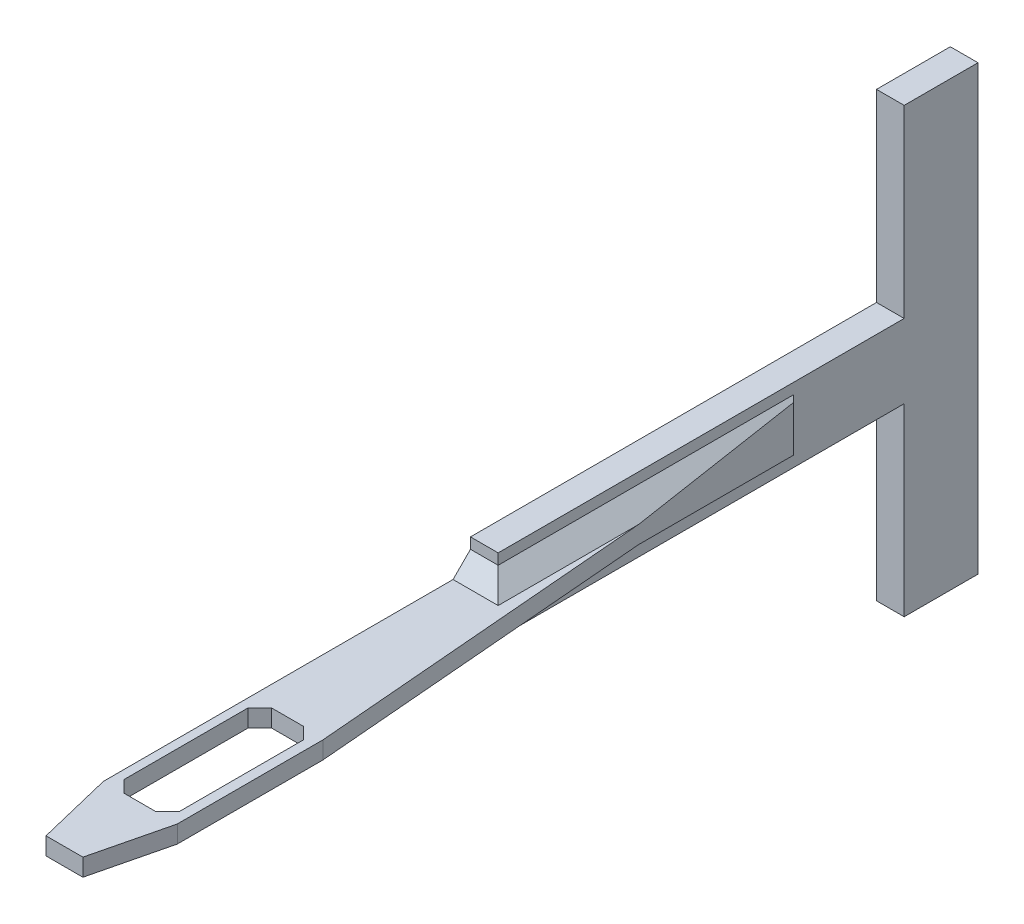
ISO-10303-21;
HEADER;
FILE_DESCRIPTION(('STEP AP214'),'2;1');
FILE_NAME('part.step','',(''),(''),'','','');
FILE_SCHEMA(('AUTOMOTIVE_DESIGN { 1 0 10303 214 1 1 1 1 }'));
ENDSEC;
DATA;
#1=APPLICATION_CONTEXT('core data for automotive mechanical design processes');
#2=APPLICATION_PROTOCOL_DEFINITION('international standard','automotive_design',2000,#1);
#3=PRODUCT_CONTEXT('',#1,'mechanical');
#4=PRODUCT('Part','Part','',(#3));
#5=PRODUCT_RELATED_PRODUCT_CATEGORY('part','',(#4));
#6=PRODUCT_DEFINITION_FORMATION('','',#4);
#7=PRODUCT_DEFINITION_CONTEXT('part definition',#1,'design');
#8=PRODUCT_DEFINITION('design','',#6,#7);
#9=PRODUCT_DEFINITION_SHAPE('','',#8);
#10=(LENGTH_UNIT() NAMED_UNIT(*) SI_UNIT(.MILLI.,.METRE.));
#11=(NAMED_UNIT(*) PLANE_ANGLE_UNIT() SI_UNIT($,.RADIAN.));
#12=(NAMED_UNIT(*) SI_UNIT($,.STERADIAN.) SOLID_ANGLE_UNIT());
#13=UNCERTAINTY_MEASURE_WITH_UNIT(LENGTH_MEASURE(1.E-05),#10,'distance_accuracy_value','');
#14=(GEOMETRIC_REPRESENTATION_CONTEXT(3) GLOBAL_UNCERTAINTY_ASSIGNED_CONTEXT((#13)) GLOBAL_UNIT_ASSIGNED_CONTEXT((#10,
#11,#12)) REPRESENTATION_CONTEXT('',''));
#15=CARTESIAN_POINT('',(0.,0.,0.));
#16=DIRECTION('',(0.,0.,1.));
#17=DIRECTION('',(1.,0.,0.));
#18=AXIS2_PLACEMENT_3D('',#15,#16,#17);
#19=CARTESIAN_POINT('',(0.,3.,0.));
#20=DIRECTION('',(0.,1.,0.));
#21=DIRECTION('',(0.,0.,1.));
#22=AXIS2_PLACEMENT_3D('',#19,#20,#21);
#23=PLANE('',#22);
#24=DIRECTION('',(0.0830454798537444,0.,0.996545758244879));
#25=VECTOR('',#24,1.);
#26=CARTESIAN_POINT('',(3.17499999999983,3.,-50.7999999999999));
#27=LINE('',#26,#25);
#28=CARTESIAN_POINT('',(1.41250000000058,3.,-71.9499999999898));
#29=VERTEX_POINT('',#28);
#30=CARTESIAN_POINT('',(6.35,3.,-12.6999999999999));
#31=VERTEX_POINT('',#30);
#32=EDGE_CURVE('E277',#29,#31,#27,.T.);
#33=ORIENTED_EDGE('',*,*,#32,.F.);
#34=DIRECTION('',(0.,0.,1.));
#35=VECTOR('',#34,1.);
#36=CARTESIAN_POINT('',(1.41250000000042,3.,-50.7999999999999));
#37=LINE('',#36,#35);
#38=CARTESIAN_POINT('',(1.4125000000004,3.,-47.7999999999999));
#39=VERTEX_POINT('',#38);
#40=EDGE_CURVE('E396',#29,#39,#37,.T.);
#41=ORIENTED_EDGE('',*,*,#40,.T.);
#42=DIRECTION('',(-1.,0.,0.));
#43=VECTOR('',#42,1.);
#44=CARTESIAN_POINT('',(-6.34999999999954,3.,-47.8));
#45=LINE('',#44,#43);
#46=CARTESIAN_POINT('',(-6.35000000000017,3.,-47.8));
#47=VERTEX_POINT('',#46);
#48=EDGE_CURVE('E394',#39,#47,#45,.T.);
#49=ORIENTED_EDGE('',*,*,#48,.T.);
#50=DIRECTION('',(0.,0.,1.));
#51=VECTOR('',#50,1.);
#52=CARTESIAN_POINT('',(-6.35000000000017,3.,-25.3999999999999));
#53=LINE('',#52,#51);
#54=CARTESIAN_POINT('',(-6.35,3.,12.3426855325893));
#55=VERTEX_POINT('',#54);
#56=EDGE_CURVE('E313',#47,#55,#53,.T.);
#57=ORIENTED_EDGE('',*,*,#56,.T.);
#58=DIRECTION('',(0.236274045216728,0.,0.971686459490367));
#59=VECTOR('',#58,1.);
#60=CARTESIAN_POINT('',(-6.35,3.,12.3426855325893));
#61=LINE('',#60,#59);
#62=CARTESIAN_POINT('',(-3.17499999999986,3.,25.4000000000001));
#63=VERTEX_POINT('',#62);
#64=EDGE_CURVE('E310',#55,#63,#61,.T.);
#65=ORIENTED_EDGE('',*,*,#64,.T.);
#66=DIRECTION('',(1.,0.,0.));
#67=VECTOR('',#66,1.);
#68=CARTESIAN_POINT('',(3.175,3.,25.4));
#69=LINE('',#68,#67);
#70=CARTESIAN_POINT('',(3.175,3.,25.4));
#71=VERTEX_POINT('',#70);
#72=EDGE_CURVE('E312',#63,#71,#69,.T.);
#73=ORIENTED_EDGE('',*,*,#72,.T.);
#74=DIRECTION('',(0.236274045216719,0.,-0.971686459490369));
#75=VECTOR('',#74,1.);
#76=CARTESIAN_POINT('',(6.35,3.,12.3426855325893));
#77=LINE('',#76,#75);
#78=CARTESIAN_POINT('',(6.35,3.,12.3426855325893));
#79=VERTEX_POINT('',#78);
#80=EDGE_CURVE('E315',#71,#79,#77,.T.);
#81=ORIENTED_EDGE('',*,*,#80,.T.);
#82=DIRECTION('',(0.,0.,-1.));
#83=VECTOR('',#82,1.);
#84=CARTESIAN_POINT('',(6.35,3.,12.3426855325893));
#85=LINE('',#84,#83);
#86=EDGE_CURVE('E317',#79,#31,#85,.T.);
#87=ORIENTED_EDGE('',*,*,#86,.T.);
#88=EDGE_LOOP('',(#33,#41,#49,#57,#65,#73,#81,#87));
#89=FACE_BOUND('',#88,.T.);
#90=DIRECTION('',(1.,0.,0.));
#91=VECTOR('',#90,1.);
#92=CARTESIAN_POINT('',(4.67317138314732,3.,12.3426855325893));
#93=LINE('',#92,#91);
#94=CARTESIAN_POINT('',(-2.85182861685268,3.,12.3426855325893));
#95=VERTEX_POINT('',#94);
#96=CARTESIAN_POINT('',(2.67317138314731,3.,12.3426855325893));
#97=VERTEX_POINT('',#96);
#98=EDGE_CURVE('E289',#95,#97,#93,.T.);
#99=ORIENTED_EDGE('',*,*,#98,.F.);
#100=DIRECTION('',(0.707106781186544,0.,0.707106781186551));
#101=VECTOR('',#100,1.);
#102=CARTESIAN_POINT('',(-4.85182861685268,3.,10.3426855325893));
#103=LINE('',#102,#101);
#104=CARTESIAN_POINT('',(-4.85182861685268,3.,10.3426855325893));
#105=VERTEX_POINT('',#104);
#106=EDGE_CURVE('E364',#95,#105,#103,.F.);
#107=ORIENTED_EDGE('',*,*,#106,.T.);
#108=DIRECTION('',(0.,0.,1.));
#109=VECTOR('',#108,1.);
#110=CARTESIAN_POINT('',(-4.85182861685268,3.,12.3426855325893));
#111=LINE('',#110,#109);
#112=CARTESIAN_POINT('',(-4.85182861685268,3.,-11.0573144674107));
#113=VERTEX_POINT('',#112);
#114=EDGE_CURVE('E286',#113,#105,#111,.T.);
#115=ORIENTED_EDGE('',*,*,#114,.F.);
#116=DIRECTION('',(-0.707106781186549,0.,0.707106781186546));
#117=VECTOR('',#116,1.);
#118=CARTESIAN_POINT('',(-2.85182861685267,3.,-13.0573144674107));
#119=LINE('',#118,#117);
#120=CARTESIAN_POINT('',(-2.85182861685267,3.,-13.0573144674107));
#121=VERTEX_POINT('',#120);
#122=EDGE_CURVE('E376',#113,#121,#119,.F.);
#123=ORIENTED_EDGE('',*,*,#122,.T.);
#124=DIRECTION('',(-1.,0.,0.));
#125=VECTOR('',#124,1.);
#126=CARTESIAN_POINT('',(4.67317138314732,3.,-13.0573144674107));
#127=LINE('',#126,#125);
#128=CARTESIAN_POINT('',(2.67317138314732,3.,-13.0573144674107));
#129=VERTEX_POINT('',#128);
#130=EDGE_CURVE('E296',#129,#121,#127,.T.);
#131=ORIENTED_EDGE('',*,*,#130,.F.);
#132=DIRECTION('',(-0.707106781186544,0.,-0.707106781186552));
#133=VECTOR('',#132,1.);
#134=CARTESIAN_POINT('',(4.67317138314732,3.,-11.0573144674107));
#135=LINE('',#134,#133);
#136=CARTESIAN_POINT('',(4.67317138314732,3.,-11.0573144674107));
#137=VERTEX_POINT('',#136);
#138=EDGE_CURVE('E372',#129,#137,#135,.F.);
#139=ORIENTED_EDGE('',*,*,#138,.T.);
#140=DIRECTION('',(0.,0.,-1.));
#141=VECTOR('',#140,1.);
#142=CARTESIAN_POINT('',(4.67317138314732,3.,12.3426855325893));
#143=LINE('',#142,#141);
#144=CARTESIAN_POINT('',(4.67317138314732,3.,10.3426855325893));
#145=VERTEX_POINT('',#144);
#146=EDGE_CURVE('E293',#145,#137,#143,.T.);
#147=ORIENTED_EDGE('',*,*,#146,.F.);
#148=DIRECTION('',(0.70710678118655,0.,-0.707106781186545));
#149=VECTOR('',#148,1.);
#150=CARTESIAN_POINT('',(2.67317138314731,3.,12.3426855325893));
#151=LINE('',#150,#149);
#152=EDGE_CURVE('E368',#145,#97,#151,.F.);
#153=ORIENTED_EDGE('',*,*,#152,.T.);
#154=EDGE_LOOP('',(#99,#107,#115,#123,#131,#139,#147,#153));
#155=FACE_BOUND('',#154,.T.);
#156=ADVANCED_FACE('F33',(#89,#155),#23,.T.);
#157=CARTESIAN_POINT('',(0.,0.,0.));
#158=DIRECTION('',(0.,1.,0.));
#159=DIRECTION('',(0.,0.,1.));
#160=AXIS2_PLACEMENT_3D('',#157,#158,#159);
#161=PLANE('',#160);
#162=DIRECTION('',(1.,0.,0.));
#163=VECTOR('',#162,1.);
#164=CARTESIAN_POINT('',(3.67817689336587E-13,0.,-47.7999999999999));
#165=LINE('',#164,#163);
#166=CARTESIAN_POINT('',(-6.34999999999954,0.,-47.8));
#167=VERTEX_POINT('',#166);
#168=CARTESIAN_POINT('',(1.4125000000004,0.,-47.7999999999999));
#169=VERTEX_POINT('',#168);
#170=EDGE_CURVE('E388',#167,#169,#165,.T.);
#171=ORIENTED_EDGE('',*,*,#170,.T.);
#172=DIRECTION('',(0.,0.,-1.));
#173=VECTOR('',#172,1.);
#174=CARTESIAN_POINT('',(1.41250000000003,0.,0.));
#175=LINE('',#174,#173);
#176=CARTESIAN_POINT('',(1.41250000000058,0.,-71.9499999999898));
#177=VERTEX_POINT('',#176);
#178=EDGE_CURVE('E390',#169,#177,#175,.T.);
#179=ORIENTED_EDGE('',*,*,#178,.T.);
#180=DIRECTION('',(0.0830454798537444,0.,0.996545758244879));
#181=VECTOR('',#180,1.);
#182=CARTESIAN_POINT('',(7.35724137931039,0.,-0.613103448275899));
#183=LINE('',#182,#181);
#184=CARTESIAN_POINT('',(6.35,0.,-12.6999999999999));
#185=VERTEX_POINT('',#184);
#186=EDGE_CURVE('E283',#177,#185,#183,.T.);
#187=ORIENTED_EDGE('',*,*,#186,.T.);
#188=DIRECTION('',(0.,0.,-1.));
#189=VECTOR('',#188,1.);
#190=CARTESIAN_POINT('',(6.34999999999983,0.,-25.4000000000001));
#191=LINE('',#190,#189);
#192=CARTESIAN_POINT('',(6.35,0.,12.3426855325893));
#193=VERTEX_POINT('',#192);
#194=EDGE_CURVE('E328',#193,#185,#191,.T.);
#195=ORIENTED_EDGE('',*,*,#194,.F.);
#196=DIRECTION('',(0.236274045216719,0.,-0.971686459490369));
#197=VECTOR('',#196,1.);
#198=CARTESIAN_POINT('',(6.35,0.,12.3426855325893));
#199=LINE('',#198,#197);
#200=CARTESIAN_POINT('',(3.175,0.,25.4));
#201=VERTEX_POINT('',#200);
#202=EDGE_CURVE('E325',#201,#193,#199,.T.);
#203=ORIENTED_EDGE('',*,*,#202,.F.);
#204=DIRECTION('',(1.,0.,0.));
#205=VECTOR('',#204,1.);
#206=CARTESIAN_POINT('',(3.175,0.,25.4));
#207=LINE('',#206,#205);
#208=CARTESIAN_POINT('',(-3.17499999999986,0.,25.4000000000001));
#209=VERTEX_POINT('',#208);
#210=EDGE_CURVE('E323',#209,#201,#207,.T.);
#211=ORIENTED_EDGE('',*,*,#210,.F.);
#212=DIRECTION('',(0.236274045216728,0.,0.971686459490367));
#213=VECTOR('',#212,1.);
#214=CARTESIAN_POINT('',(-6.35,0.,12.3426855325893));
#215=LINE('',#214,#213);
#216=CARTESIAN_POINT('',(-6.35,0.,12.3426855325893));
#217=VERTEX_POINT('',#216);
#218=EDGE_CURVE('E321',#217,#209,#215,.T.);
#219=ORIENTED_EDGE('',*,*,#218,.F.);
#220=DIRECTION('',(0.,0.,1.));
#221=VECTOR('',#220,1.);
#222=CARTESIAN_POINT('',(-6.35,0.,12.3426855325893));
#223=LINE('',#222,#221);
#224=EDGE_CURVE('E299',#167,#217,#223,.T.);
#225=ORIENTED_EDGE('',*,*,#224,.F.);
#226=EDGE_LOOP('',(#171,#179,#187,#195,#203,#211,#219,#225));
#227=FACE_BOUND('',#226,.T.);
#228=DIRECTION('',(-1.,0.,0.));
#229=VECTOR('',#228,1.);
#230=CARTESIAN_POINT('',(4.67317138314732,0.,-13.0573144674107));
#231=LINE('',#230,#229);
#232=CARTESIAN_POINT('',(2.67317138314732,0.,-13.0573144674107));
#233=VERTEX_POINT('',#232);
#234=CARTESIAN_POINT('',(-2.85182861685267,0.,-13.0573144674107));
#235=VERTEX_POINT('',#234);
#236=EDGE_CURVE('E290',#233,#235,#231,.T.);
#237=ORIENTED_EDGE('',*,*,#236,.T.);
#238=DIRECTION('',(0.707106781186549,0.,-0.707106781186546));
#239=VECTOR('',#238,1.);
#240=CARTESIAN_POINT('',(-7.95457154213169,0.,-7.95457154213173));
#241=LINE('',#240,#239);
#242=CARTESIAN_POINT('',(-4.85182861685268,0.,-11.0573144674107));
#243=VERTEX_POINT('',#242);
#244=EDGE_CURVE('E374',#235,#243,#241,.F.);
#245=ORIENTED_EDGE('',*,*,#244,.T.);
#246=DIRECTION('',(0.,0.,1.));
#247=VECTOR('',#246,1.);
#248=CARTESIAN_POINT('',(-4.85182861685268,0.,12.3426855325893));
#249=LINE('',#248,#247);
#250=CARTESIAN_POINT('',(-4.85182861685268,0.,10.3426855325893));
#251=VERTEX_POINT('',#250);
#252=EDGE_CURVE('E285',#243,#251,#249,.T.);
#253=ORIENTED_EDGE('',*,*,#252,.T.);
#254=DIRECTION('',(-0.707106781186544,0.,-0.707106781186551));
#255=VECTOR('',#254,1.);
#256=CARTESIAN_POINT('',(-7.597257074721,0.,7.59725707472092));
#257=LINE('',#256,#255);
#258=CARTESIAN_POINT('',(-2.85182861685268,0.,12.3426855325893));
#259=VERTEX_POINT('',#258);
#260=EDGE_CURVE('E362',#251,#259,#257,.F.);
#261=ORIENTED_EDGE('',*,*,#260,.T.);
#262=DIRECTION('',(1.,0.,0.));
#263=VECTOR('',#262,1.);
#264=CARTESIAN_POINT('',(4.67317138314732,0.,12.3426855325893));
#265=LINE('',#264,#263);
#266=CARTESIAN_POINT('',(2.67317138314731,0.,12.3426855325893));
#267=VERTEX_POINT('',#266);
#268=EDGE_CURVE('E302',#259,#267,#265,.T.);
#269=ORIENTED_EDGE('',*,*,#268,.T.);
#270=DIRECTION('',(-0.70710678118655,0.,0.707106781186545));
#271=VECTOR('',#270,1.);
#272=CARTESIAN_POINT('',(7.50792845786829,0.,7.50792845786834));
#273=LINE('',#272,#271);
#274=CARTESIAN_POINT('',(4.67317138314732,0.,10.3426855325893));
#275=VERTEX_POINT('',#274);
#276=EDGE_CURVE('E366',#267,#275,#273,.F.);
#277=ORIENTED_EDGE('',*,*,#276,.T.);
#278=DIRECTION('',(0.,0.,-1.));
#279=VECTOR('',#278,1.);
#280=CARTESIAN_POINT('',(4.67317138314732,0.,12.3426855325893));
#281=LINE('',#280,#279);
#282=CARTESIAN_POINT('',(4.67317138314732,0.,-11.0573144674107));
#283=VERTEX_POINT('',#282);
#284=EDGE_CURVE('E305',#275,#283,#281,.T.);
#285=ORIENTED_EDGE('',*,*,#284,.T.);
#286=DIRECTION('',(0.707106781186544,0.,0.707106781186552));
#287=VECTOR('',#286,1.);
#288=CARTESIAN_POINT('',(7.86524292527903,0.,-7.86524292527894));
#289=LINE('',#288,#287);
#290=EDGE_CURVE('E370',#283,#233,#289,.F.);
#291=ORIENTED_EDGE('',*,*,#290,.T.);
#292=EDGE_LOOP('',(#237,#245,#253,#261,#269,#277,#285,#291));
#293=FACE_BOUND('',#292,.T.);
#294=ADVANCED_FACE('F518',(#227,#293),#161,.F.);
#295=CARTESIAN_POINT('',(-6.35,3.,12.3426855325893));
#296=DIRECTION('',(1.,0.,0.));
#297=DIRECTION('',(0.,0.,-1.));
#298=AXIS2_PLACEMENT_3D('',#295,#296,#297);
#299=PLANE('',#298);
#300=DIRECTION('',(0.,1.,0.));
#301=VECTOR('',#300,1.);
#302=CARTESIAN_POINT('',(-6.34999999999951,-4.85000000000001,-50.7999999999999));
#303=LINE('',#302,#301);
#304=CARTESIAN_POINT('',(-6.34999999999951,-4.85000000000001,-50.7999999999999));
#305=VERTEX_POINT('',#304);
#306=CARTESIAN_POINT('',(-6.34999999999951,-2.99999999999997,-50.7999999999999));
#307=VERTEX_POINT('',#306);
#308=EDGE_CURVE('E273',#305,#307,#303,.T.);
#309=ORIENTED_EDGE('',*,*,#308,.T.);
#310=DIRECTION('',(0.,0.707106781186552,0.707106781186543));
#311=VECTOR('',#310,1.);
#312=CARTESIAN_POINT('',(-6.34999999999978,31.5713427662947,-16.2286572337057));
#313=LINE('',#312,#311);
#314=EDGE_CURVE('E406',#307,#167,#313,.T.);
#315=ORIENTED_EDGE('',*,*,#314,.T.);
#316=ORIENTED_EDGE('',*,*,#224,.T.);
#317=DIRECTION('',(0.,-1.,0.));
#318=VECTOR('',#317,1.);
#319=CARTESIAN_POINT('',(-6.35,3.,12.3426855325893));
#320=LINE('',#319,#318);
#321=EDGE_CURVE('E339',#55,#217,#320,.T.);
#322=ORIENTED_EDGE('',*,*,#321,.F.);
#323=ORIENTED_EDGE('',*,*,#56,.F.);
#324=DIRECTION('',(0.,-0.707106781186548,0.707106781186547));
#325=VECTOR('',#324,1.);
#326=CARTESIAN_POINT('',(-6.34999999999977,-27.0713427662946,-17.7286572337054));
#327=LINE('',#326,#325);
#328=CARTESIAN_POINT('',(-6.34999999999951,5.99999999999994,-50.7999999999999));
#329=VERTEX_POINT('',#328);
#330=EDGE_CURVE('E11',#47,#329,#327,.F.);
#331=ORIENTED_EDGE('',*,*,#330,.T.);
#332=CARTESIAN_POINT('',(-6.34999999999951,7.84999999999999,-50.7999999999999));
#333=VERTEX_POINT('',#332);
#334=EDGE_CURVE('E269',#329,#333,#303,.T.);
#335=ORIENTED_EDGE('',*,*,#334,.T.);
#336=DIRECTION('',(0.,0.,-1.));
#337=VECTOR('',#336,1.);
#338=CARTESIAN_POINT('',(-6.34999999999898,7.84999999999999,-120.65));
#339=LINE('',#338,#337);
#340=CARTESIAN_POINT('',(-6.34999999999898,7.84999999999999,-120.65));
#341=VERTEX_POINT('',#340);
#342=EDGE_CURVE('E237',#333,#341,#339,.T.);
#343=ORIENTED_EDGE('',*,*,#342,.T.);
#344=DIRECTION('',(0.,1.,0.));
#345=VECTOR('',#344,1.);
#346=CARTESIAN_POINT('',(-6.34999999999898,7.84999999999999,-120.65));
#347=LINE('',#346,#345);
#348=CARTESIAN_POINT('',(-6.34999999999898,39.6,-120.65));
#349=VERTEX_POINT('',#348);
#350=EDGE_CURVE('E479',#341,#349,#347,.T.);
#351=ORIENTED_EDGE('',*,*,#350,.T.);
#352=DIRECTION('',(0.,0.,-1.));
#353=VECTOR('',#352,1.);
#354=CARTESIAN_POINT('',(-6.34999999999898,39.6,-120.65));
#355=LINE('',#354,#353);
#356=CARTESIAN_POINT('',(-6.34999999999888,39.6,-133.35));
#357=VERTEX_POINT('',#356);
#358=EDGE_CURVE('E483',#349,#357,#355,.T.);
#359=ORIENTED_EDGE('',*,*,#358,.T.);
#360=DIRECTION('',(0.,-1.,0.));
#361=VECTOR('',#360,1.);
#362=CARTESIAN_POINT('',(-6.34999999999888,-36.6,-133.35));
#363=LINE('',#362,#361);
#364=CARTESIAN_POINT('',(-6.34999999999888,-36.6,-133.35));
#365=VERTEX_POINT('',#364);
#366=EDGE_CURVE('E484',#357,#365,#363,.T.);
#367=ORIENTED_EDGE('',*,*,#366,.T.);
#368=DIRECTION('',(0.,0.,1.));
#369=VECTOR('',#368,1.);
#370=CARTESIAN_POINT('',(-6.34999999999898,-36.6,-120.65));
#371=LINE('',#370,#369);
#372=CARTESIAN_POINT('',(-6.34999999999898,-36.6,-120.65));
#373=VERTEX_POINT('',#372);
#374=EDGE_CURVE('E489',#365,#373,#371,.T.);
#375=ORIENTED_EDGE('',*,*,#374,.T.);
#376=DIRECTION('',(0.,1.,0.));
#377=VECTOR('',#376,1.);
#378=CARTESIAN_POINT('',(-6.34999999999898,-36.6,-120.65));
#379=LINE('',#378,#377);
#380=CARTESIAN_POINT('',(-6.34999999999898,-4.85000000000001,-120.65));
#381=VERTEX_POINT('',#380);
#382=EDGE_CURVE('E491',#373,#381,#379,.T.);
#383=ORIENTED_EDGE('',*,*,#382,.T.);
#384=DIRECTION('',(0.,0.,1.));
#385=VECTOR('',#384,1.);
#386=CARTESIAN_POINT('',(-6.34999999999898,-4.85000000000001,-120.65));
#387=LINE('',#386,#385);
#388=EDGE_CURVE('E230',#381,#305,#387,.T.);
#389=ORIENTED_EDGE('',*,*,#388,.T.);
#390=EDGE_LOOP('',(#309,#315,#316,#322,#323,#331,#335,#343,#351,#359,#367,#375,#383,#389));
#391=FACE_BOUND('',#390,.T.);
#392=ADVANCED_FACE('F429',(#391),#299,.F.);
#393=CARTESIAN_POINT('',(-6.35,3.,12.3426855325893));
#394=DIRECTION('',(0.971686459490366,0.,-0.236274045216728));
#395=DIRECTION('',(-0.236274045216728,0.,-0.971686459490366));
#396=AXIS2_PLACEMENT_3D('',#393,#394,#395);
#397=PLANE('',#396);
#398=ORIENTED_EDGE('',*,*,#218,.T.);
#399=DIRECTION('',(0.,-1.,0.));
#400=VECTOR('',#399,1.);
#401=CARTESIAN_POINT('',(-3.17499999999986,3.,25.4000000000001));
#402=LINE('',#401,#400);
#403=EDGE_CURVE('E336',#63,#209,#402,.T.);
#404=ORIENTED_EDGE('',*,*,#403,.F.);
#405=ORIENTED_EDGE('',*,*,#64,.F.);
#406=ORIENTED_EDGE('',*,*,#321,.T.);
#407=EDGE_LOOP('',(#398,#404,#405,#406));
#408=FACE_BOUND('',#407,.T.);
#409=ADVANCED_FACE('F435',(#408),#397,.F.);
#410=CARTESIAN_POINT('',(3.175,3.,25.4));
#411=DIRECTION('',(0.,0.,-1.));
#412=DIRECTION('',(-1.,0.,0.));
#413=AXIS2_PLACEMENT_3D('',#410,#411,#412);
#414=PLANE('',#413);
#415=ORIENTED_EDGE('',*,*,#210,.T.);
#416=DIRECTION('',(0.,-1.,0.));
#417=VECTOR('',#416,1.);
#418=CARTESIAN_POINT('',(3.175,3.,25.4));
#419=LINE('',#418,#417);
#420=EDGE_CURVE('E333',#71,#201,#419,.T.);
#421=ORIENTED_EDGE('',*,*,#420,.F.);
#422=ORIENTED_EDGE('',*,*,#72,.F.);
#423=ORIENTED_EDGE('',*,*,#403,.T.);
#424=EDGE_LOOP('',(#415,#421,#422,#423));
#425=FACE_BOUND('',#424,.T.);
#426=ADVANCED_FACE('F441',(#425),#414,.F.);
#427=CARTESIAN_POINT('',(6.35,3.,12.3426855325893));
#428=DIRECTION('',(-0.971686459490369,0.,-0.236274045216719));
#429=DIRECTION('',(-0.236274045216719,0.,0.971686459490369));
#430=AXIS2_PLACEMENT_3D('',#427,#428,#429);
#431=PLANE('',#430);
#432=ORIENTED_EDGE('',*,*,#202,.T.);
#433=DIRECTION('',(0.,-1.,0.));
#434=VECTOR('',#433,1.);
#435=CARTESIAN_POINT('',(6.35,3.,12.3426855325893));
#436=LINE('',#435,#434);
#437=EDGE_CURVE('E320',#79,#193,#436,.T.);
#438=ORIENTED_EDGE('',*,*,#437,.F.);
#439=ORIENTED_EDGE('',*,*,#80,.F.);
#440=ORIENTED_EDGE('',*,*,#420,.T.);
#441=EDGE_LOOP('',(#432,#438,#439,#440));
#442=FACE_BOUND('',#441,.T.);
#443=ADVANCED_FACE('F445',(#442),#431,.F.);
#444=CARTESIAN_POINT('',(6.34999999999983,3.,-25.4000000000001));
#445=DIRECTION('',(-1.,0.,0.));
#446=DIRECTION('',(0.,0.,1.));
#447=AXIS2_PLACEMENT_3D('',#444,#445,#446);
#448=PLANE('',#447);
#449=ORIENTED_EDGE('',*,*,#194,.T.);
#450=DIRECTION('',(0.,1.,0.));
#451=VECTOR('',#450,1.);
#452=CARTESIAN_POINT('',(6.35,-22.4,-12.6999999999999));
#453=LINE('',#452,#451);
#454=EDGE_CURVE('E279',#185,#31,#453,.T.);
#455=ORIENTED_EDGE('',*,*,#454,.T.);
#456=ORIENTED_EDGE('',*,*,#86,.F.);
#457=ORIENTED_EDGE('',*,*,#437,.T.);
#458=EDGE_LOOP('',(#449,#455,#456,#457));
#459=FACE_BOUND('',#458,.T.);
#460=ADVANCED_FACE('F448',(#459),#448,.F.);
#461=CARTESIAN_POINT('',(-4.85182861685268,3.,12.3426855325893));
#462=DIRECTION('',(1.,0.,0.));
#463=DIRECTION('',(0.,0.,-1.));
#464=AXIS2_PLACEMENT_3D('',#461,#462,#463);
#465=PLANE('',#464);
#466=ORIENTED_EDGE('',*,*,#114,.T.);
#467=DIRECTION('',(0.,-1.,0.));
#468=VECTOR('',#467,1.);
#469=CARTESIAN_POINT('',(-4.85182861685268,0.,10.3426855325893));
#470=LINE('',#469,#468);
#471=EDGE_CURVE('E344',#105,#251,#470,.T.);
#472=ORIENTED_EDGE('',*,*,#471,.T.);
#473=ORIENTED_EDGE('',*,*,#252,.F.);
#474=DIRECTION('',(0.,1.,0.));
#475=VECTOR('',#474,1.);
#476=CARTESIAN_POINT('',(-4.85182861685268,3.,-11.0573144674107));
#477=LINE('',#476,#475);
#478=EDGE_CURVE('E342',#243,#113,#477,.T.);
#479=ORIENTED_EDGE('',*,*,#478,.T.);
#480=EDGE_LOOP('',(#466,#472,#473,#479));
#481=FACE_BOUND('',#480,.T.);
#482=ADVANCED_FACE('F526',(#481),#465,.T.);
#483=CARTESIAN_POINT('',(4.67317138314732,3.,12.3426855325893));
#484=DIRECTION('',(0.,0.,-1.));
#485=DIRECTION('',(-1.,0.,0.));
#486=AXIS2_PLACEMENT_3D('',#483,#484,#485);
#487=PLANE('',#486);
#488=ORIENTED_EDGE('',*,*,#268,.F.);
#489=DIRECTION('',(0.,1.,0.));
#490=VECTOR('',#489,1.);
#491=CARTESIAN_POINT('',(-2.85182861685268,3.,12.3426855325893));
#492=LINE('',#491,#490);
#493=EDGE_CURVE('E350',#259,#95,#492,.T.);
#494=ORIENTED_EDGE('',*,*,#493,.T.);
#495=ORIENTED_EDGE('',*,*,#98,.T.);
#496=DIRECTION('',(0.,-1.,0.));
#497=VECTOR('',#496,1.);
#498=CARTESIAN_POINT('',(2.67317138314731,0.,12.3426855325893));
#499=LINE('',#498,#497);
#500=EDGE_CURVE('E347',#97,#267,#499,.T.);
#501=ORIENTED_EDGE('',*,*,#500,.T.);
#502=EDGE_LOOP('',(#488,#494,#495,#501));
#503=FACE_BOUND('',#502,.T.);
#504=ADVANCED_FACE('F690',(#503),#487,.T.);
#505=CARTESIAN_POINT('',(4.67317138314732,3.,12.3426855325893));
#506=DIRECTION('',(-1.,0.,0.));
#507=DIRECTION('',(0.,0.,1.));
#508=AXIS2_PLACEMENT_3D('',#505,#506,#507);
#509=PLANE('',#508);
#510=ORIENTED_EDGE('',*,*,#284,.F.);
#511=DIRECTION('',(0.,1.,0.));
#512=VECTOR('',#511,1.);
#513=CARTESIAN_POINT('',(4.67317138314732,3.,10.3426855325893));
#514=LINE('',#513,#512);
#515=EDGE_CURVE('E355',#275,#145,#514,.T.);
#516=ORIENTED_EDGE('',*,*,#515,.T.);
#517=ORIENTED_EDGE('',*,*,#146,.T.);
#518=DIRECTION('',(0.,-1.,0.));
#519=VECTOR('',#518,1.);
#520=CARTESIAN_POINT('',(4.67317138314732,0.,-11.0573144674107));
#521=LINE('',#520,#519);
#522=EDGE_CURVE('E352',#137,#283,#521,.T.);
#523=ORIENTED_EDGE('',*,*,#522,.T.);
#524=EDGE_LOOP('',(#510,#516,#517,#523));
#525=FACE_BOUND('',#524,.T.);
#526=ADVANCED_FACE('F680',(#525),#509,.T.);
#527=CARTESIAN_POINT('',(4.67317138314732,3.,-13.0573144674107));
#528=DIRECTION('',(0.,0.,1.));
#529=DIRECTION('',(1.,0.,0.));
#530=AXIS2_PLACEMENT_3D('',#527,#528,#529);
#531=PLANE('',#530);
#532=ORIENTED_EDGE('',*,*,#236,.F.);
#533=DIRECTION('',(0.,1.,0.));
#534=VECTOR('',#533,1.);
#535=CARTESIAN_POINT('',(2.67317138314732,3.,-13.0573144674107));
#536=LINE('',#535,#534);
#537=EDGE_CURVE('E360',#233,#129,#536,.T.);
#538=ORIENTED_EDGE('',*,*,#537,.T.);
#539=ORIENTED_EDGE('',*,*,#130,.T.);
#540=DIRECTION('',(0.,-1.,0.));
#541=VECTOR('',#540,1.);
#542=CARTESIAN_POINT('',(-2.85182861685267,0.,-13.0573144674107));
#543=LINE('',#542,#541);
#544=EDGE_CURVE('E357',#121,#235,#543,.T.);
#545=ORIENTED_EDGE('',*,*,#544,.T.);
#546=EDGE_LOOP('',(#532,#538,#539,#545));
#547=FACE_BOUND('',#546,.T.);
#548=ADVANCED_FACE('F543',(#547),#531,.T.);
#549=CARTESIAN_POINT('',(-4.85182861685268,3.,10.3426855325893));
#550=DIRECTION('',(0.707106781186551,0.,-0.707106781186544));
#551=DIRECTION('',(0.,1.,0.));
#552=AXIS2_PLACEMENT_3D('',#549,#550,#551);
#553=PLANE('',#552);
#554=ORIENTED_EDGE('',*,*,#106,.F.);
#555=ORIENTED_EDGE('',*,*,#493,.F.);
#556=ORIENTED_EDGE('',*,*,#260,.F.);
#557=ORIENTED_EDGE('',*,*,#471,.F.);
#558=EDGE_LOOP('',(#554,#555,#556,#557));
#559=FACE_BOUND('',#558,.T.);
#560=ADVANCED_FACE('F539',(#559),#553,.T.);
#561=CARTESIAN_POINT('',(2.67317138314731,3.,12.3426855325893));
#562=DIRECTION('',(-0.707106781186545,0.,-0.70710678118655));
#563=DIRECTION('',(0.,1.,0.));
#564=AXIS2_PLACEMENT_3D('',#561,#562,#563);
#565=PLANE('',#564);
#566=ORIENTED_EDGE('',*,*,#152,.F.);
#567=ORIENTED_EDGE('',*,*,#515,.F.);
#568=ORIENTED_EDGE('',*,*,#276,.F.);
#569=ORIENTED_EDGE('',*,*,#500,.F.);
#570=EDGE_LOOP('',(#566,#567,#568,#569));
#571=FACE_BOUND('',#570,.T.);
#572=ADVANCED_FACE('F542',(#571),#565,.T.);
#573=CARTESIAN_POINT('',(4.67317138314732,3.,-11.0573144674107));
#574=DIRECTION('',(-0.707106781186551,0.,0.707106781186543));
#575=DIRECTION('',(0.,1.,0.));
#576=AXIS2_PLACEMENT_3D('',#573,#574,#575);
#577=PLANE('',#576);
#578=ORIENTED_EDGE('',*,*,#138,.F.);
#579=ORIENTED_EDGE('',*,*,#537,.F.);
#580=ORIENTED_EDGE('',*,*,#290,.F.);
#581=ORIENTED_EDGE('',*,*,#522,.F.);
#582=EDGE_LOOP('',(#578,#579,#580,#581));
#583=FACE_BOUND('',#582,.T.);
#584=ADVANCED_FACE('F547',(#583),#577,.T.);
#585=CARTESIAN_POINT('',(-2.85182861685267,3.,-13.0573144674107));
#586=DIRECTION('',(0.707106781186546,0.,0.707106781186549));
#587=DIRECTION('',(0.,1.,0.));
#588=AXIS2_PLACEMENT_3D('',#585,#586,#587);
#589=PLANE('',#588);
#590=ORIENTED_EDGE('',*,*,#122,.F.);
#591=ORIENTED_EDGE('',*,*,#478,.F.);
#592=ORIENTED_EDGE('',*,*,#244,.F.);
#593=ORIENTED_EDGE('',*,*,#544,.F.);
#594=EDGE_LOOP('',(#590,#591,#592,#593));
#595=FACE_BOUND('',#594,.T.);
#596=ADVANCED_FACE('F551',(#595),#589,.T.);
#597=CARTESIAN_POINT('',(3.17499999999983,-22.4,-50.7999999999999));
#598=DIRECTION('',(-0.996545758244879,0.,0.0830454798537444));
#599=DIRECTION('',(0.0830454798537444,0.,0.996545758244879));
#600=AXIS2_PLACEMENT_3D('',#597,#598,#599);
#601=PLANE('',#600);
#602=ORIENTED_EDGE('',*,*,#186,.F.);
#603=DIRECTION('',(-0.0827605888602411,-0.08276058886025,-0.99312706632284));
#604=VECTOR('',#603,1.);
#605=CARTESIAN_POINT('',(3.00950342465733,1.59700342465692,-52.7859589041098));
#606=LINE('',#605,#604);
#607=CARTESIAN_POINT('',(-1.01022727272781,-2.42272727272866,-101.022727272729));
#608=VERTEX_POINT('',#607);
#609=EDGE_CURVE('E401',#177,#608,#606,.T.);
#610=ORIENTED_EDGE('',*,*,#609,.T.);
#611=DIRECTION('',(0.,1.,0.));
#612=VECTOR('',#611,1.);
#613=CARTESIAN_POINT('',(-1.01022727272781,-22.4,-101.022727272729));
#614=LINE('',#613,#612);
#615=CARTESIAN_POINT('',(-1.01022727272781,5.42272727272862,-101.022727272729));
#616=VERTEX_POINT('',#615);
#617=EDGE_CURVE('E50',#608,#616,#614,.T.);
#618=ORIENTED_EDGE('',*,*,#617,.T.);
#619=DIRECTION('',(-0.0827605888602411,0.0827605888602487,-0.99312706632284));
#620=VECTOR('',#619,1.);
#621=CARTESIAN_POINT('',(3.33690068493137,1.07559931506904,-48.8571917808215));
#622=LINE('',#621,#620);
#623=EDGE_CURVE('E42',#616,#29,#622,.F.);
#624=ORIENTED_EDGE('',*,*,#623,.T.);
#625=ORIENTED_EDGE('',*,*,#32,.T.);
#626=ORIENTED_EDGE('',*,*,#454,.F.);
#627=EDGE_LOOP('',(#602,#610,#618,#624,#625,#626));
#628=FACE_BOUND('',#627,.T.);
#629=ADVANCED_FACE('F451',(#628),#601,.F.);
#630=CARTESIAN_POINT('',(-1.58749999999951,-4.85000000000001,-50.7999999999999));
#631=DIRECTION('',(0.,0.,1.));
#632=DIRECTION('',(1.,0.,0.));
#633=AXIS2_PLACEMENT_3D('',#630,#631,#632);
#634=PLANE('',#633);
#635=ORIENTED_EDGE('',*,*,#334,.F.);
#636=DIRECTION('',(1.,0.,0.));
#637=VECTOR('',#636,1.);
#638=CARTESIAN_POINT('',(-1.58749999999951,5.99999999999993,-50.7999999999999));
#639=LINE('',#638,#637);
#640=CARTESIAN_POINT('',(-1.58749999999951,5.99999999999994,-50.7999999999999));
#641=VERTEX_POINT('',#640);
#642=EDGE_CURVE('E224',#329,#641,#639,.T.);
#643=ORIENTED_EDGE('',*,*,#642,.T.);
#644=DIRECTION('',(0.,1.,0.));
#645=VECTOR('',#644,1.);
#646=CARTESIAN_POINT('',(-1.58749999999951,-4.85000000000001,-50.7999999999999));
#647=LINE('',#646,#645);
#648=CARTESIAN_POINT('',(-1.58749999999951,7.84999999999999,-50.7999999999999));
#649=VERTEX_POINT('',#648);
#650=EDGE_CURVE('E217',#641,#649,#647,.T.);
#651=ORIENTED_EDGE('',*,*,#650,.T.);
#652=DIRECTION('',(-1.,0.,0.));
#653=VECTOR('',#652,1.);
#654=CARTESIAN_POINT('',(-1.58749999999951,7.84999999999999,-50.7999999999999));
#655=LINE('',#654,#653);
#656=EDGE_CURVE('E221',#649,#333,#655,.T.);
#657=ORIENTED_EDGE('',*,*,#656,.T.);
#658=EDGE_LOOP('',(#635,#643,#651,#657));
#659=FACE_BOUND('',#658,.T.);
#660=ADVANCED_FACE('F220',(#659),#634,.T.);
#661=CARTESIAN_POINT('',(-1.58749999999951,-4.85000000000001,-50.7999999999999));
#662=VERTEX_POINT('',#661);
#663=CARTESIAN_POINT('',(-1.58749999999951,-2.99999999999997,-50.7999999999999));
#664=VERTEX_POINT('',#663);
#665=EDGE_CURVE('E229',#662,#664,#647,.T.);
#666=ORIENTED_EDGE('',*,*,#665,.T.);
#667=DIRECTION('',(-1.,0.,0.));
#668=VECTOR('',#667,1.);
#669=CARTESIAN_POINT('',(-1.58749999999951,-2.99999999999997,-50.7999999999999));
#670=LINE('',#669,#668);
#671=EDGE_CURVE('E392',#664,#307,#670,.T.);
#672=ORIENTED_EDGE('',*,*,#671,.T.);
#673=ORIENTED_EDGE('',*,*,#308,.F.);
#674=DIRECTION('',(-1.,0.,0.));
#675=VECTOR('',#674,1.);
#676=CARTESIAN_POINT('',(-1.58749999999951,-4.85000000000001,-50.7999999999999));
#677=LINE('',#676,#675);
#678=EDGE_CURVE('E280',#662,#305,#677,.T.);
#679=ORIENTED_EDGE('',*,*,#678,.F.);
#680=EDGE_LOOP('',(#666,#672,#673,#679));
#681=FACE_BOUND('',#680,.T.);
#682=ADVANCED_FACE('F458',(#681),#634,.T.);
#683=CARTESIAN_POINT('',(-1.58749999999898,-4.85000000000001,-120.65));
#684=DIRECTION('',(0.,-1.,0.));
#685=DIRECTION('',(0.,0.,-1.));
#686=AXIS2_PLACEMENT_3D('',#683,#684,#685);
#687=PLANE('',#686);
#688=ORIENTED_EDGE('',*,*,#388,.F.);
#689=DIRECTION('',(-1.,0.,0.));
#690=VECTOR('',#689,1.);
#691=CARTESIAN_POINT('',(-1.58749999999898,-4.85000000000001,-120.65));
#692=LINE('',#691,#690);
#693=CARTESIAN_POINT('',(-1.58749999999898,-4.85000000000001,-120.65));
#694=VERTEX_POINT('',#693);
#695=EDGE_CURVE('E463',#694,#381,#692,.T.);
#696=ORIENTED_EDGE('',*,*,#695,.F.);
#697=DIRECTION('',(0.,0.,1.));
#698=VECTOR('',#697,1.);
#699=CARTESIAN_POINT('',(-1.58749999999898,-4.85000000000001,-120.65));
#700=LINE('',#699,#698);
#701=EDGE_CURVE('E239',#694,#662,#700,.T.);
#702=ORIENTED_EDGE('',*,*,#701,.T.);
#703=ORIENTED_EDGE('',*,*,#678,.T.);
#704=EDGE_LOOP('',(#688,#696,#702,#703));
#705=FACE_BOUND('',#704,.T.);
#706=ADVANCED_FACE('F495',(#705),#687,.T.);
#707=CARTESIAN_POINT('',(-1.58749999999898,-36.6,-120.65));
#708=DIRECTION('',(0.,0.,1.));
#709=DIRECTION('',(1.,0.,0.));
#710=AXIS2_PLACEMENT_3D('',#707,#708,#709);
#711=PLANE('',#710);
#712=ORIENTED_EDGE('',*,*,#382,.F.);
#713=DIRECTION('',(-1.,0.,0.));
#714=VECTOR('',#713,1.);
#715=CARTESIAN_POINT('',(-1.58749999999898,-36.6,-120.65));
#716=LINE('',#715,#714);
#717=CARTESIAN_POINT('',(-1.58749999999898,-36.6,-120.65));
#718=VERTEX_POINT('',#717);
#719=EDGE_CURVE('E465',#718,#373,#716,.T.);
#720=ORIENTED_EDGE('',*,*,#719,.F.);
#721=DIRECTION('',(0.,1.,0.));
#722=VECTOR('',#721,1.);
#723=CARTESIAN_POINT('',(-1.58749999999898,-36.6,-120.65));
#724=LINE('',#723,#722);
#725=EDGE_CURVE('E259',#718,#694,#724,.T.);
#726=ORIENTED_EDGE('',*,*,#725,.T.);
#727=ORIENTED_EDGE('',*,*,#695,.T.);
#728=EDGE_LOOP('',(#712,#720,#726,#727));
#729=FACE_BOUND('',#728,.T.);
#730=ADVANCED_FACE('F498',(#729),#711,.T.);
#731=CARTESIAN_POINT('',(-1.58749999999898,-36.6,-120.65));
#732=DIRECTION('',(0.,-1.,0.));
#733=DIRECTION('',(0.,0.,-1.));
#734=AXIS2_PLACEMENT_3D('',#731,#732,#733);
#735=PLANE('',#734);
#736=ORIENTED_EDGE('',*,*,#374,.F.);
#737=DIRECTION('',(-1.,0.,0.));
#738=VECTOR('',#737,1.);
#739=CARTESIAN_POINT('',(-1.58749999999888,-36.6,-133.35));
#740=LINE('',#739,#738);
#741=CARTESIAN_POINT('',(-1.58749999999888,-36.6,-133.35));
#742=VERTEX_POINT('',#741);
#743=EDGE_CURVE('E471',#742,#365,#740,.T.);
#744=ORIENTED_EDGE('',*,*,#743,.F.);
#745=DIRECTION('',(0.,0.,1.));
#746=VECTOR('',#745,1.);
#747=CARTESIAN_POINT('',(-1.58749999999898,-36.6,-120.65));
#748=LINE('',#747,#746);
#749=EDGE_CURVE('E256',#742,#718,#748,.T.);
#750=ORIENTED_EDGE('',*,*,#749,.T.);
#751=ORIENTED_EDGE('',*,*,#719,.T.);
#752=EDGE_LOOP('',(#736,#744,#750,#751));
#753=FACE_BOUND('',#752,.T.);
#754=ADVANCED_FACE('F503',(#753),#735,.T.);
#755=CARTESIAN_POINT('',(-1.58749999999888,-36.6,-133.35));
#756=DIRECTION('',(0.,0.,-1.));
#757=DIRECTION('',(-1.,0.,0.));
#758=AXIS2_PLACEMENT_3D('',#755,#756,#757);
#759=PLANE('',#758);
#760=ORIENTED_EDGE('',*,*,#366,.F.);
#761=DIRECTION('',(-1.,0.,0.));
#762=VECTOR('',#761,1.);
#763=CARTESIAN_POINT('',(-1.58749999999888,39.6,-133.35));
#764=LINE('',#763,#762);
#765=CARTESIAN_POINT('',(-1.58749999999888,39.6,-133.35));
#766=VERTEX_POINT('',#765);
#767=EDGE_CURVE('E473',#766,#357,#764,.T.);
#768=ORIENTED_EDGE('',*,*,#767,.F.);
#769=DIRECTION('',(0.,-1.,0.));
#770=VECTOR('',#769,1.);
#771=CARTESIAN_POINT('',(-1.58749999999888,-36.6,-133.35));
#772=LINE('',#771,#770);
#773=EDGE_CURVE('E253',#766,#742,#772,.T.);
#774=ORIENTED_EDGE('',*,*,#773,.T.);
#775=ORIENTED_EDGE('',*,*,#743,.T.);
#776=EDGE_LOOP('',(#760,#768,#774,#775));
#777=FACE_BOUND('',#776,.T.);
#778=ADVANCED_FACE('F506',(#777),#759,.T.);
#779=CARTESIAN_POINT('',(-1.58749999999898,39.6,-120.65));
#780=DIRECTION('',(0.,1.,0.));
#781=DIRECTION('',(0.,0.,1.));
#782=AXIS2_PLACEMENT_3D('',#779,#780,#781);
#783=PLANE('',#782);
#784=ORIENTED_EDGE('',*,*,#358,.F.);
#785=DIRECTION('',(-1.,0.,0.));
#786=VECTOR('',#785,1.);
#787=CARTESIAN_POINT('',(-1.58749999999898,39.6,-120.65));
#788=LINE('',#787,#786);
#789=CARTESIAN_POINT('',(-1.58749999999898,39.6,-120.65));
#790=VERTEX_POINT('',#789);
#791=EDGE_CURVE('E475',#790,#349,#788,.T.);
#792=ORIENTED_EDGE('',*,*,#791,.F.);
#793=DIRECTION('',(0.,0.,-1.));
#794=VECTOR('',#793,1.);
#795=CARTESIAN_POINT('',(-1.58749999999898,39.6,-120.65));
#796=LINE('',#795,#794);
#797=EDGE_CURVE('E247',#790,#766,#796,.T.);
#798=ORIENTED_EDGE('',*,*,#797,.T.);
#799=ORIENTED_EDGE('',*,*,#767,.T.);
#800=EDGE_LOOP('',(#784,#792,#798,#799));
#801=FACE_BOUND('',#800,.T.);
#802=ADVANCED_FACE('F508',(#801),#783,.T.);
#803=CARTESIAN_POINT('',(-1.58749999999898,7.84999999999999,-120.65));
#804=DIRECTION('',(0.,0.,1.));
#805=DIRECTION('',(1.,0.,0.));
#806=AXIS2_PLACEMENT_3D('',#803,#804,#805);
#807=PLANE('',#806);
#808=ORIENTED_EDGE('',*,*,#350,.F.);
#809=DIRECTION('',(-1.,0.,0.));
#810=VECTOR('',#809,1.);
#811=CARTESIAN_POINT('',(-1.58749999999898,7.84999999999999,-120.65));
#812=LINE('',#811,#810);
#813=CARTESIAN_POINT('',(-1.58749999999898,7.84999999999999,-120.65));
#814=VERTEX_POINT('',#813);
#815=EDGE_CURVE('E238',#814,#341,#812,.T.);
#816=ORIENTED_EDGE('',*,*,#815,.F.);
#817=DIRECTION('',(0.,1.,0.));
#818=VECTOR('',#817,1.);
#819=CARTESIAN_POINT('',(-1.58749999999898,7.84999999999999,-120.65));
#820=LINE('',#819,#818);
#821=EDGE_CURVE('E245',#814,#790,#820,.T.);
#822=ORIENTED_EDGE('',*,*,#821,.T.);
#823=ORIENTED_EDGE('',*,*,#791,.T.);
#824=EDGE_LOOP('',(#808,#816,#822,#823));
#825=FACE_BOUND('',#824,.T.);
#826=ADVANCED_FACE('F480',(#825),#807,.T.);
#827=CARTESIAN_POINT('',(-1.58749999999898,7.84999999999999,-120.65));
#828=DIRECTION('',(0.,1.,0.));
#829=DIRECTION('',(0.,0.,1.));
#830=AXIS2_PLACEMENT_3D('',#827,#828,#829);
#831=PLANE('',#830);
#832=ORIENTED_EDGE('',*,*,#342,.F.);
#833=ORIENTED_EDGE('',*,*,#656,.F.);
#834=DIRECTION('',(0.,0.,-1.));
#835=VECTOR('',#834,1.);
#836=CARTESIAN_POINT('',(-1.58749999999898,7.84999999999999,-120.65));
#837=LINE('',#836,#835);
#838=EDGE_CURVE('E235',#649,#814,#837,.T.);
#839=ORIENTED_EDGE('',*,*,#838,.T.);
#840=ORIENTED_EDGE('',*,*,#815,.T.);
#841=EDGE_LOOP('',(#832,#833,#839,#840));
#842=FACE_BOUND('',#841,.T.);
#843=ADVANCED_FACE('F234',(#842),#831,.T.);
#844=CARTESIAN_POINT('',(-1.5874999999999,0.,0.));
#845=DIRECTION('',(1.,0.,0.));
#846=DIRECTION('',(0.,0.,-1.));
#847=AXIS2_PLACEMENT_3D('',#844,#845,#846);
#848=PLANE('',#847);
#849=DIRECTION('',(0.,-1.,0.));
#850=VECTOR('',#849,1.);
#851=CARTESIAN_POINT('',(-1.58749999999912,0.,-101.6));
#852=LINE('',#851,#850);
#853=CARTESIAN_POINT('',(-1.58749999999912,5.99999999999993,-101.6));
#854=VERTEX_POINT('',#853);
#855=CARTESIAN_POINT('',(-1.58749999999912,-2.99999999999998,-101.6));
#856=VERTEX_POINT('',#855);
#857=EDGE_CURVE('E378',#854,#856,#852,.T.);
#858=ORIENTED_EDGE('',*,*,#857,.T.);
#859=DIRECTION('',(0.,0.,1.));
#860=VECTOR('',#859,1.);
#861=CARTESIAN_POINT('',(-1.5874999999999,-2.99999999999998,0.));
#862=LINE('',#861,#860);
#863=EDGE_CURVE('E386',#856,#664,#862,.T.);
#864=ORIENTED_EDGE('',*,*,#863,.T.);
#865=ORIENTED_EDGE('',*,*,#665,.F.);
#866=ORIENTED_EDGE('',*,*,#701,.F.);
#867=ORIENTED_EDGE('',*,*,#725,.F.);
#868=ORIENTED_EDGE('',*,*,#749,.F.);
#869=ORIENTED_EDGE('',*,*,#773,.F.);
#870=ORIENTED_EDGE('',*,*,#797,.F.);
#871=ORIENTED_EDGE('',*,*,#821,.F.);
#872=ORIENTED_EDGE('',*,*,#838,.F.);
#873=ORIENTED_EDGE('',*,*,#650,.F.);
#874=DIRECTION('',(0.,0.,-1.));
#875=VECTOR('',#874,1.);
#876=CARTESIAN_POINT('',(-1.58749999999912,5.99999999999993,-101.6));
#877=LINE('',#876,#875);
#878=EDGE_CURVE('E422',#641,#854,#877,.T.);
#879=ORIENTED_EDGE('',*,*,#878,.T.);
#880=EDGE_LOOP('',(#858,#864,#865,#866,#867,#868,#869,#870,#871,#872,#873,#879));
#881=FACE_BOUND('',#880,.T.);
#882=ADVANCED_FACE('F242',(#881),#848,.T.);
#883=CARTESIAN_POINT('',(49.212500000001,3.,-50.7999999999999));
#884=DIRECTION('',(-0.707106781186549,0.,0.707106781186546));
#885=DIRECTION('',(0.,1.,0.));
#886=AXIS2_PLACEMENT_3D('',#883,#884,#885);
#887=PLANE('',#886);
#888=ORIENTED_EDGE('',*,*,#617,.F.);
#889=DIRECTION('',(-0.577350269189621,-0.577350269189633,-0.577350269189623));
#890=VECTOR('',#889,1.);
#891=CARTESIAN_POINT('',(34.2791666666672,32.8666666666671,-65.7333333333338));
#892=LINE('',#891,#890);
#893=EDGE_CURVE('E402',#608,#856,#892,.T.);
#894=ORIENTED_EDGE('',*,*,#893,.T.);
#895=ORIENTED_EDGE('',*,*,#857,.F.);
#896=DIRECTION('',(-0.577350269189623,0.577350269189628,-0.577350269189626));
#897=VECTOR('',#896,1.);
#898=CARTESIAN_POINT('',(33.2791666666675,-28.8666666666669,-66.7333333333335));
#899=LINE('',#898,#897);
#900=EDGE_CURVE('E408',#854,#616,#899,.F.);
#901=ORIENTED_EDGE('',*,*,#900,.T.);
#902=EDGE_LOOP('',(#888,#894,#895,#901));
#903=FACE_BOUND('',#902,.T.);
#904=ADVANCED_FACE('F556',(#903),#887,.F.);
#905=CARTESIAN_POINT('',(-1.58749999999951,-2.99999999999998,-50.7999999999999));
#906=DIRECTION('',(0.,0.707106781186543,-0.707106781186552));
#907=DIRECTION('',(-1.,0.,0.));
#908=AXIS2_PLACEMENT_3D('',#905,#906,#907);
#909=PLANE('',#908);
#910=ORIENTED_EDGE('',*,*,#314,.F.);
#911=ORIENTED_EDGE('',*,*,#671,.F.);
#912=DIRECTION('',(0.577350269189618,0.577350269189631,0.577350269189628));
#913=VECTOR('',#912,1.);
#914=CARTESIAN_POINT('',(-1.58749999999951,-2.99999999999998,-50.7999999999999));
#915=LINE('',#914,#913);
#916=EDGE_CURVE('E410',#169,#664,#915,.F.);
#917=ORIENTED_EDGE('',*,*,#916,.F.);
#918=ORIENTED_EDGE('',*,*,#170,.F.);
#919=EDGE_LOOP('',(#910,#911,#917,#918));
#920=FACE_BOUND('',#919,.T.);
#921=ADVANCED_FACE('F559',(#920),#909,.F.);
#922=CARTESIAN_POINT('',(-1.5874999999999,-2.99999999999998,0.));
#923=DIRECTION('',(-0.707106781186553,0.707106781186542,0.));
#924=DIRECTION('',(0.,0.,1.));
#925=AXIS2_PLACEMENT_3D('',#922,#923,#924);
#926=PLANE('',#925);
#927=ORIENTED_EDGE('',*,*,#609,.F.);
#928=ORIENTED_EDGE('',*,*,#178,.F.);
#929=ORIENTED_EDGE('',*,*,#916,.T.);
#930=ORIENTED_EDGE('',*,*,#863,.F.);
#931=ORIENTED_EDGE('',*,*,#893,.F.);
#932=EDGE_LOOP('',(#927,#928,#929,#930,#931));
#933=FACE_BOUND('',#932,.T.);
#934=ADVANCED_FACE('F560',(#933),#926,.F.);
#935=CARTESIAN_POINT('',(3.67817689336587E-13,3.,-47.7999999999999));
#936=DIRECTION('',(0.,0.707106781186547,0.707106781186548));
#937=DIRECTION('',(1.,0.,0.));
#938=AXIS2_PLACEMENT_3D('',#935,#936,#937);
#939=PLANE('',#938);
#940=ORIENTED_EDGE('',*,*,#330,.F.);
#941=ORIENTED_EDGE('',*,*,#48,.F.);
#942=DIRECTION('',(-0.577350269189622,0.577350269189626,-0.57735026918963));
#943=VECTOR('',#942,1.);
#944=CARTESIAN_POINT('',(0.941666666667057,3.47083333333334,-48.2708333333333));
#945=LINE('',#944,#943);
#946=EDGE_CURVE('E37',#641,#39,#945,.F.);
#947=ORIENTED_EDGE('',*,*,#946,.F.);
#948=ORIENTED_EDGE('',*,*,#642,.F.);
#949=EDGE_LOOP('',(#940,#941,#947,#948));
#950=FACE_BOUND('',#949,.T.);
#951=ADVANCED_FACE('F35',(#950),#939,.T.);
#952=CARTESIAN_POINT('',(-1.5874999999999,5.99999999999993,0.));
#953=DIRECTION('',(0.707106781186547,0.707106781186548,0.));
#954=DIRECTION('',(0.,0.,1.));
#955=AXIS2_PLACEMENT_3D('',#952,#953,#954);
#956=PLANE('',#955);
#957=ORIENTED_EDGE('',*,*,#946,.T.);
#958=ORIENTED_EDGE('',*,*,#40,.F.);
#959=ORIENTED_EDGE('',*,*,#623,.F.);
#960=ORIENTED_EDGE('',*,*,#900,.F.);
#961=ORIENTED_EDGE('',*,*,#878,.F.);
#962=EDGE_LOOP('',(#957,#958,#959,#960,#961));
#963=FACE_BOUND('',#962,.T.);
#964=ADVANCED_FACE('F419',(#963),#956,.T.);
#965=CLOSED_SHELL('',(#156,#294,#392,#409,#426,#443,#460,#482,#504,#526,#548,#560,#572,#584,
#596,#629,#660,#682,#706,#730,#754,#778,#802,#826,#843,#882,#904,#921,#934,#951,#964));
#966=MANIFOLD_SOLID_BREP('B2',#965);
#967=ADVANCED_BREP_SHAPE_REPRESENTATION('',(#18,#966),#14);
#968=SHAPE_DEFINITION_REPRESENTATION(#9,#967);
ENDSEC;
END-ISO-10303-21;
